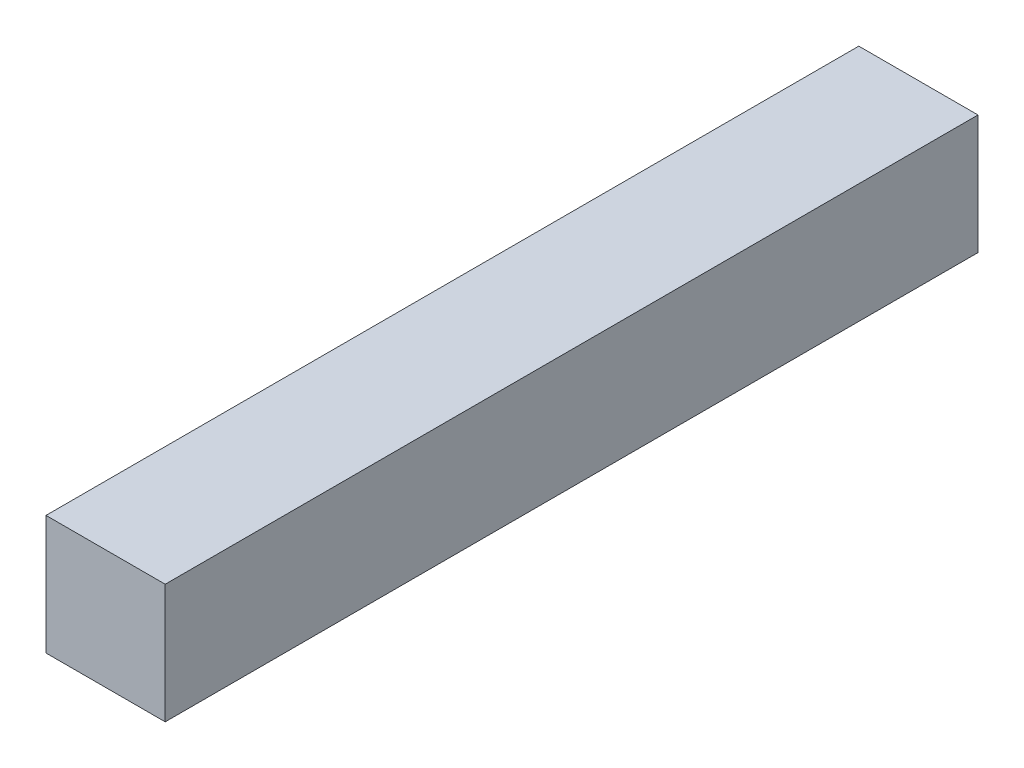
ISO-10303-21;
HEADER;
FILE_DESCRIPTION(('STEP AP214'),'2;1');
FILE_NAME('part.step','',(''),(''),'','','');
FILE_SCHEMA(('AUTOMOTIVE_DESIGN { 1 0 10303 214 1 1 1 1 }'));
ENDSEC;
DATA;
#1=APPLICATION_CONTEXT('core data for automotive mechanical design processes');
#2=APPLICATION_PROTOCOL_DEFINITION('international standard','automotive_design',2000,#1);
#3=PRODUCT_CONTEXT('',#1,'mechanical');
#4=PRODUCT('Part','Part','',(#3));
#5=PRODUCT_RELATED_PRODUCT_CATEGORY('part','',(#4));
#6=PRODUCT_DEFINITION_FORMATION('','',#4);
#7=PRODUCT_DEFINITION_CONTEXT('part definition',#1,'design');
#8=PRODUCT_DEFINITION('design','',#6,#7);
#9=PRODUCT_DEFINITION_SHAPE('','',#8);
#10=(LENGTH_UNIT() NAMED_UNIT(*) SI_UNIT(.MILLI.,.METRE.));
#11=(NAMED_UNIT(*) PLANE_ANGLE_UNIT() SI_UNIT($,.RADIAN.));
#12=(NAMED_UNIT(*) SI_UNIT($,.STERADIAN.) SOLID_ANGLE_UNIT());
#13=UNCERTAINTY_MEASURE_WITH_UNIT(LENGTH_MEASURE(1.E-05),#10,'distance_accuracy_value','');
#14=(GEOMETRIC_REPRESENTATION_CONTEXT(3) GLOBAL_UNCERTAINTY_ASSIGNED_CONTEXT((#13)) GLOBAL_UNIT_ASSIGNED_CONTEXT((#10,
#11,#12)) REPRESENTATION_CONTEXT('',''));
#15=CARTESIAN_POINT('',(0.,0.,0.));
#16=DIRECTION('',(0.,0.,1.));
#17=DIRECTION('',(1.,0.,0.));
#18=AXIS2_PLACEMENT_3D('',#15,#16,#17);
#19=CARTESIAN_POINT('',(11.,11.,150.));
#20=DIRECTION('',(-1.,0.,0.));
#21=DIRECTION('',(0.,-1.,0.));
#22=AXIS2_PLACEMENT_3D('',#19,#20,#21);
#23=PLANE('',#22);
#24=DIRECTION('',(0.,1.,0.));
#25=VECTOR('',#24,1.);
#26=CARTESIAN_POINT('',(11.,11.,0.));
#27=LINE('',#26,#25);
#28=CARTESIAN_POINT('',(11.,-11.,0.));
#29=VERTEX_POINT('',#28);
#30=CARTESIAN_POINT('',(11.,11.,0.));
#31=VERTEX_POINT('',#30);
#32=EDGE_CURVE('E95',#29,#31,#27,.T.);
#33=ORIENTED_EDGE('',*,*,#32,.T.);
#34=DIRECTION('',(0.,0.,-1.));
#35=VECTOR('',#34,1.);
#36=CARTESIAN_POINT('',(11.,11.,150.));
#37=LINE('',#36,#35);
#38=CARTESIAN_POINT('',(11.,11.,150.));
#39=VERTEX_POINT('',#38);
#40=EDGE_CURVE('E11',#39,#31,#37,.T.);
#41=ORIENTED_EDGE('',*,*,#40,.F.);
#42=DIRECTION('',(0.,1.,0.));
#43=VECTOR('',#42,1.);
#44=CARTESIAN_POINT('',(11.,11.,150.));
#45=LINE('',#44,#43);
#46=CARTESIAN_POINT('',(11.,-11.,150.));
#47=VERTEX_POINT('',#46);
#48=EDGE_CURVE('E83',#47,#39,#45,.T.);
#49=ORIENTED_EDGE('',*,*,#48,.F.);
#50=DIRECTION('',(0.,0.,-1.));
#51=VECTOR('',#50,1.);
#52=CARTESIAN_POINT('',(11.,-11.,150.));
#53=LINE('',#52,#51);
#54=EDGE_CURVE('E91',#47,#29,#53,.T.);
#55=ORIENTED_EDGE('',*,*,#54,.T.);
#56=EDGE_LOOP('',(#33,#41,#49,#55));
#57=FACE_BOUND('',#56,.T.);
#58=ADVANCED_FACE('F32',(#57),#23,.F.);
#59=CARTESIAN_POINT('',(-11.,11.,150.));
#60=DIRECTION('',(0.,-1.,0.));
#61=DIRECTION('',(0.,0.,-1.));
#62=AXIS2_PLACEMENT_3D('',#59,#60,#61);
#63=PLANE('',#62);
#64=DIRECTION('',(-1.,0.,0.));
#65=VECTOR('',#64,1.);
#66=CARTESIAN_POINT('',(-11.,11.,0.));
#67=LINE('',#66,#65);
#68=CARTESIAN_POINT('',(-11.,11.,0.));
#69=VERTEX_POINT('',#68);
#70=EDGE_CURVE('E87',#31,#69,#67,.T.);
#71=ORIENTED_EDGE('',*,*,#70,.T.);
#72=DIRECTION('',(0.,0.,-1.));
#73=VECTOR('',#72,1.);
#74=CARTESIAN_POINT('',(-11.,11.,150.));
#75=LINE('',#74,#73);
#76=CARTESIAN_POINT('',(-11.,11.,150.));
#77=VERTEX_POINT('',#76);
#78=EDGE_CURVE('E40',#77,#69,#75,.T.);
#79=ORIENTED_EDGE('',*,*,#78,.F.);
#80=DIRECTION('',(-1.,0.,0.));
#81=VECTOR('',#80,1.);
#82=CARTESIAN_POINT('',(-11.,11.,150.));
#83=LINE('',#82,#81);
#84=EDGE_CURVE('E78',#39,#77,#83,.T.);
#85=ORIENTED_EDGE('',*,*,#84,.F.);
#86=ORIENTED_EDGE('',*,*,#40,.T.);
#87=EDGE_LOOP('',(#71,#79,#85,#86));
#88=FACE_BOUND('',#87,.T.);
#89=ADVANCED_FACE('F86',(#88),#63,.F.);
#90=CARTESIAN_POINT('',(-11.,11.,150.));
#91=DIRECTION('',(1.,0.,0.));
#92=DIRECTION('',(0.,1.,0.));
#93=AXIS2_PLACEMENT_3D('',#90,#91,#92);
#94=PLANE('',#93);
#95=DIRECTION('',(0.,-1.,0.));
#96=VECTOR('',#95,1.);
#97=CARTESIAN_POINT('',(-11.,11.,0.));
#98=LINE('',#97,#96);
#99=CARTESIAN_POINT('',(-11.,-11.,0.));
#100=VERTEX_POINT('',#99);
#101=EDGE_CURVE('E65',#69,#100,#98,.T.);
#102=ORIENTED_EDGE('',*,*,#101,.T.);
#103=DIRECTION('',(0.,0.,-1.));
#104=VECTOR('',#103,1.);
#105=CARTESIAN_POINT('',(-11.,-11.,150.));
#106=LINE('',#105,#104);
#107=CARTESIAN_POINT('',(-11.,-11.,150.));
#108=VERTEX_POINT('',#107);
#109=EDGE_CURVE('E88',#108,#100,#106,.T.);
#110=ORIENTED_EDGE('',*,*,#109,.F.);
#111=DIRECTION('',(0.,-1.,0.));
#112=VECTOR('',#111,1.);
#113=CARTESIAN_POINT('',(-11.,11.,150.));
#114=LINE('',#113,#112);
#115=EDGE_CURVE('E81',#77,#108,#114,.T.);
#116=ORIENTED_EDGE('',*,*,#115,.F.);
#117=ORIENTED_EDGE('',*,*,#78,.T.);
#118=EDGE_LOOP('',(#102,#110,#116,#117));
#119=FACE_BOUND('',#118,.T.);
#120=ADVANCED_FACE('F89',(#119),#94,.F.);
#121=CARTESIAN_POINT('',(-11.,-11.,150.));
#122=DIRECTION('',(0.,1.,0.));
#123=DIRECTION('',(0.,0.,1.));
#124=AXIS2_PLACEMENT_3D('',#121,#122,#123);
#125=PLANE('',#124);
#126=DIRECTION('',(1.,0.,0.));
#127=VECTOR('',#126,1.);
#128=CARTESIAN_POINT('',(-11.,-11.,0.));
#129=LINE('',#128,#127);
#130=EDGE_CURVE('E71',#100,#29,#129,.T.);
#131=ORIENTED_EDGE('',*,*,#130,.T.);
#132=ORIENTED_EDGE('',*,*,#54,.F.);
#133=DIRECTION('',(1.,0.,0.));
#134=VECTOR('',#133,1.);
#135=CARTESIAN_POINT('',(-11.,-11.,150.));
#136=LINE('',#135,#134);
#137=EDGE_CURVE('E48',#108,#47,#136,.T.);
#138=ORIENTED_EDGE('',*,*,#137,.F.);
#139=ORIENTED_EDGE('',*,*,#109,.T.);
#140=EDGE_LOOP('',(#131,#132,#138,#139));
#141=FACE_BOUND('',#140,.T.);
#142=ADVANCED_FACE('F102',(#141),#125,.F.);
#143=CARTESIAN_POINT('',(0.,0.,150.));
#144=DIRECTION('',(0.,0.,1.));
#145=DIRECTION('',(1.,0.,0.));
#146=AXIS2_PLACEMENT_3D('',#143,#144,#145);
#147=PLANE('',#146);
#148=ORIENTED_EDGE('',*,*,#48,.T.);
#149=ORIENTED_EDGE('',*,*,#84,.T.);
#150=ORIENTED_EDGE('',*,*,#115,.T.);
#151=ORIENTED_EDGE('',*,*,#137,.T.);
#152=EDGE_LOOP('',(#148,#149,#150,#151));
#153=FACE_BOUND('',#152,.T.);
#154=ADVANCED_FACE('F79',(#153),#147,.T.);
#155=CARTESIAN_POINT('',(0.,0.,0.));
#156=DIRECTION('',(0.,0.,1.));
#157=DIRECTION('',(1.,0.,0.));
#158=AXIS2_PLACEMENT_3D('',#155,#156,#157);
#159=PLANE('',#158);
#160=ORIENTED_EDGE('',*,*,#32,.F.);
#161=ORIENTED_EDGE('',*,*,#130,.F.);
#162=ORIENTED_EDGE('',*,*,#101,.F.);
#163=ORIENTED_EDGE('',*,*,#70,.F.);
#164=EDGE_LOOP('',(#160,#161,#162,#163));
#165=FACE_BOUND('',#164,.T.);
#166=ADVANCED_FACE('F105',(#165),#159,.F.);
#167=CLOSED_SHELL('',(#58,#89,#120,#142,#154,#166));
#168=MANIFOLD_SOLID_BREP('B2',#167);
#169=ADVANCED_BREP_SHAPE_REPRESENTATION('',(#18,#168),#14);
#170=SHAPE_DEFINITION_REPRESENTATION(#9,#169);
ENDSEC;
END-ISO-10303-21;
